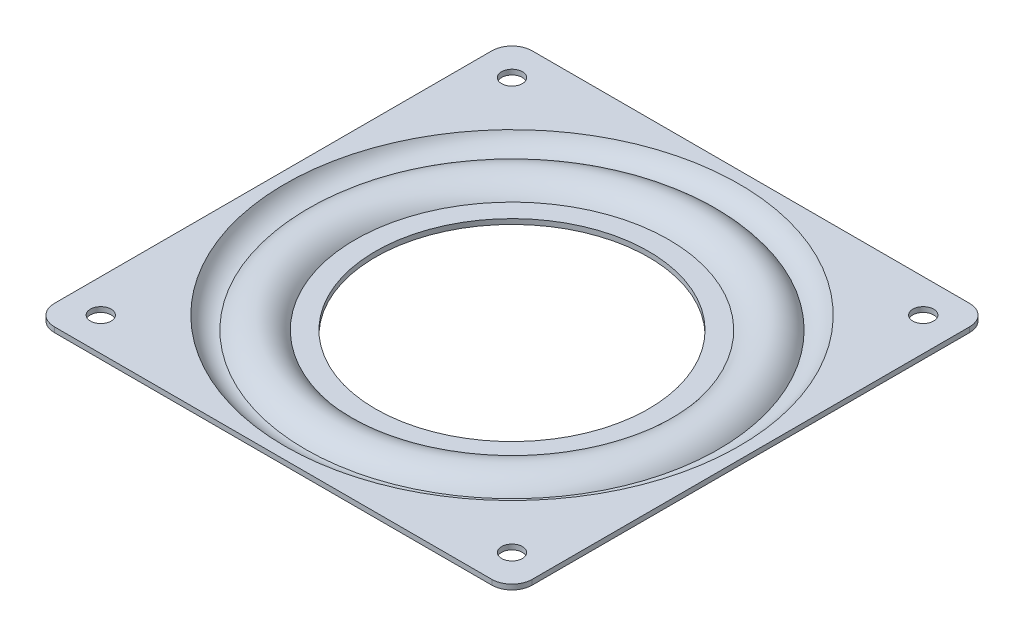
ISO-10303-21;
HEADER;
FILE_DESCRIPTION(('STEP AP214'),'2;1');
FILE_NAME('part.step','',(''),(''),'','','');
FILE_SCHEMA(('AUTOMOTIVE_DESIGN { 1 0 10303 214 1 1 1 1 }'));
ENDSEC;
DATA;
#1=APPLICATION_CONTEXT('core data for automotive mechanical design processes');
#2=APPLICATION_PROTOCOL_DEFINITION('international standard','automotive_design',2000,#1);
#3=PRODUCT_CONTEXT('',#1,'mechanical');
#4=PRODUCT('Part','Part','',(#3));
#5=PRODUCT_RELATED_PRODUCT_CATEGORY('part','',(#4));
#6=PRODUCT_DEFINITION_FORMATION('','',#4);
#7=PRODUCT_DEFINITION_CONTEXT('part definition',#1,'design');
#8=PRODUCT_DEFINITION('design','',#6,#7);
#9=PRODUCT_DEFINITION_SHAPE('','',#8);
#10=(LENGTH_UNIT() NAMED_UNIT(*) SI_UNIT(.MILLI.,.METRE.));
#11=(NAMED_UNIT(*) PLANE_ANGLE_UNIT() SI_UNIT($,.RADIAN.));
#12=(NAMED_UNIT(*) SI_UNIT($,.STERADIAN.) SOLID_ANGLE_UNIT());
#13=UNCERTAINTY_MEASURE_WITH_UNIT(LENGTH_MEASURE(1.E-05),#10,'distance_accuracy_value','');
#14=(GEOMETRIC_REPRESENTATION_CONTEXT(3) GLOBAL_UNCERTAINTY_ASSIGNED_CONTEXT((#13)) GLOBAL_UNIT_ASSIGNED_CONTEXT((#10,
#11,#12)) REPRESENTATION_CONTEXT('',''));
#15=CARTESIAN_POINT('',(0.,0.,0.));
#16=DIRECTION('',(0.,0.,1.));
#17=DIRECTION('',(1.,0.,0.));
#18=AXIS2_PLACEMENT_3D('',#15,#16,#17);
#19=CARTESIAN_POINT('',(0.,1.93021402871017,0.));
#20=DIRECTION('',(0.,1.,0.));
#21=DIRECTION('',(0.,0.,1.));
#22=AXIS2_PLACEMENT_3D('',#19,#20,#21);
#23=TOROIDAL_SURFACE('',#22,40.8455333460894,5.5);
#24=CARTESIAN_POINT('',(0.,-3.5402036630778,0.));
#25=DIRECTION('',(0.,1.,0.));
#26=DIRECTION('',(0.,0.,1.));
#27=AXIS2_PLACEMENT_3D('',#24,#25,#26);
#28=CIRCLE('',#27,40.2758577565007);
#29=CARTESIAN_POINT('',(0.,-3.5402036630778,40.2758577565007));
#30=VERTEX_POINT('',#29);
#31=EDGE_CURVE('E11',#30,#30,#28,.T.);
#32=ORIENTED_EDGE('',*,*,#31,.T.);
#33=EDGE_LOOP('',(#32));
#34=FACE_BOUND('',#33,.T.);
#35=CARTESIAN_POINT('',(0.,-1.,0.));
#36=DIRECTION('',(0.,1.,0.));
#37=DIRECTION('',(0.,0.,1.));
#38=AXIS2_PLACEMENT_3D('',#35,#36,#37);
#39=CIRCLE('',#38,45.4999770019897);
#40=CARTESIAN_POINT('',(0.,-1.,45.4999770019897));
#41=VERTEX_POINT('',#40);
#42=EDGE_CURVE('E44',#41,#41,#39,.F.);
#43=ORIENTED_EDGE('',*,*,#42,.T.);
#44=EDGE_LOOP('',(#43));
#45=FACE_BOUND('',#44,.T.);
#46=ADVANCED_FACE('F41',(#34,#45),#23,.T.);
#47=CARTESIAN_POINT('',(0.,-6.,0.));
#48=DIRECTION('',(0.,1.,0.));
#49=DIRECTION('',(0.,0.,1.));
#50=AXIS2_PLACEMENT_3D('',#47,#48,#49);
#51=TOROIDAL_SURFACE('',#50,35.9227666730447,5.);
#52=CARTESIAN_POINT('',(0.,-3.56978597128984,0.));
#53=DIRECTION('',(0.,1.,0.));
#54=DIRECTION('',(0.,0.,1.));
#55=AXIS2_PLACEMENT_3D('',#52,#53,#54);
#56=CIRCLE('',#55,31.5530916537029);
#57=CARTESIAN_POINT('',(0.,-3.56978597128984,31.5530916537029));
#58=VERTEX_POINT('',#57);
#59=EDGE_CURVE('E50',#58,#58,#56,.T.);
#60=ORIENTED_EDGE('',*,*,#59,.T.);
#61=EDGE_LOOP('',(#60));
#62=FACE_BOUND('',#61,.T.);
#63=ORIENTED_EDGE('',*,*,#31,.F.);
#64=EDGE_LOOP('',(#63));
#65=FACE_BOUND('',#64,.T.);
#66=ADVANCED_FACE('F202',(#62,#65),#51,.F.);
#67=CARTESIAN_POINT('',(0.,-3.56978597128984,0.));
#68=DIRECTION('',(0.,-1.,0.));
#69=DIRECTION('',(0.,0.,-1.));
#70=AXIS2_PLACEMENT_3D('',#67,#68,#69);
#71=PLANE('',#70);
#72=CARTESIAN_POINT('',(0.,-3.56978597128984,0.));
#73=DIRECTION('',(0.,1.,0.));
#74=DIRECTION('',(0.,0.,1.));
#75=AXIS2_PLACEMENT_3D('',#72,#73,#74);
#76=CIRCLE('',#75,27.);
#77=CARTESIAN_POINT('',(0.,-3.56978597128984,27.));
#78=VERTEX_POINT('',#77);
#79=EDGE_CURVE('E196',#78,#78,#76,.T.);
#80=ORIENTED_EDGE('',*,*,#79,.T.);
#81=EDGE_LOOP('',(#80));
#82=FACE_BOUND('',#81,.T.);
#83=ORIENTED_EDGE('',*,*,#59,.F.);
#84=EDGE_LOOP('',(#83));
#85=FACE_BOUND('',#84,.T.);
#86=ADVANCED_FACE('F205',(#82,#85),#71,.T.);
#87=CARTESIAN_POINT('',(0.,6.91716042477171,0.));
#88=DIRECTION('',(0.,1.,0.));
#89=DIRECTION('',(0.,0.,1.));
#90=AXIS2_PLACEMENT_3D('',#87,#88,#89);
#91=CYLINDRICAL_SURFACE('',#90,27.);
#92=ORIENTED_EDGE('',*,*,#79,.F.);
#93=EDGE_LOOP('',(#92));
#94=FACE_BOUND('',#93,.T.);
#95=CARTESIAN_POINT('',(0.,-2.56978597128984,0.));
#96=DIRECTION('',(0.,1.,0.));
#97=DIRECTION('',(0.,0.,1.));
#98=AXIS2_PLACEMENT_3D('',#95,#96,#97);
#99=CIRCLE('',#98,27.);
#100=CARTESIAN_POINT('',(0.,-2.56978597128984,27.));
#101=VERTEX_POINT('',#100);
#102=EDGE_CURVE('E193',#101,#101,#99,.T.);
#103=ORIENTED_EDGE('',*,*,#102,.T.);
#104=EDGE_LOOP('',(#103));
#105=FACE_BOUND('',#104,.T.);
#106=ADVANCED_FACE('F207',(#94,#105),#91,.F.);
#107=CARTESIAN_POINT('',(0.,-2.56978597128984,0.));
#108=DIRECTION('',(0.,-1.,0.));
#109=DIRECTION('',(0.,0.,-1.));
#110=AXIS2_PLACEMENT_3D('',#107,#108,#109);
#111=PLANE('',#110);
#112=ORIENTED_EDGE('',*,*,#102,.F.);
#113=EDGE_LOOP('',(#112));
#114=FACE_BOUND('',#113,.T.);
#115=CARTESIAN_POINT('',(0.,-2.56978597128984,0.));
#116=DIRECTION('',(0.,1.,0.));
#117=DIRECTION('',(0.,0.,1.));
#118=AXIS2_PLACEMENT_3D('',#115,#116,#117);
#119=CIRCLE('',#118,31.);
#120=CARTESIAN_POINT('',(0.,-2.56978597128984,31.));
#121=VERTEX_POINT('',#120);
#122=EDGE_CURVE('E190',#121,#121,#119,.T.);
#123=ORIENTED_EDGE('',*,*,#122,.T.);
#124=EDGE_LOOP('',(#123));
#125=FACE_BOUND('',#124,.T.);
#126=ADVANCED_FACE('F214',(#114,#125),#111,.F.);
#127=CARTESIAN_POINT('',(0.,-6.,0.));
#128=DIRECTION('',(0.,1.,0.));
#129=DIRECTION('',(0.,0.,1.));
#130=AXIS2_PLACEMENT_3D('',#127,#128,#129);
#131=TOROIDAL_SURFACE('',#130,35.9227666730447,6.);
#132=ORIENTED_EDGE('',*,*,#122,.F.);
#133=EDGE_LOOP('',(#132));
#134=FACE_BOUND('',#133,.T.);
#135=CARTESIAN_POINT('',(0.,-2.56978597128983,0.));
#136=DIRECTION('',(0.,1.,0.));
#137=DIRECTION('',(0.,0.,1.));
#138=AXIS2_PLACEMENT_3D('',#135,#136,#137);
#139=CIRCLE('',#138,40.8455333460895);
#140=CARTESIAN_POINT('',(0.,-2.56978597128983,40.8455333460895));
#141=VERTEX_POINT('',#140);
#142=EDGE_CURVE('E187',#141,#141,#139,.T.);
#143=ORIENTED_EDGE('',*,*,#142,.T.);
#144=EDGE_LOOP('',(#143));
#145=FACE_BOUND('',#144,.T.);
#146=ADVANCED_FACE('F309',(#134,#145),#131,.T.);
#147=CARTESIAN_POINT('',(0.,1.93021402871017,0.));
#148=DIRECTION('',(0.,1.,0.));
#149=DIRECTION('',(0.,0.,1.));
#150=AXIS2_PLACEMENT_3D('',#147,#148,#149);
#151=TOROIDAL_SURFACE('',#150,40.8455333460894,4.5);
#152=ORIENTED_EDGE('',*,*,#142,.F.);
#153=EDGE_LOOP('',(#152));
#154=FACE_BOUND('',#153,.T.);
#155=CARTESIAN_POINT('',(0.,0.,0.));
#156=DIRECTION('',(0.,1.,0.));
#157=DIRECTION('',(0.,0.,1.));
#158=AXIS2_PLACEMENT_3D('',#155,#156,#157);
#159=CIRCLE('',#158,44.9105393489596);
#160=CARTESIAN_POINT('',(0.,0.,44.9105393489596));
#161=VERTEX_POINT('',#160);
#162=EDGE_CURVE('E152',#161,#161,#159,.T.);
#163=ORIENTED_EDGE('',*,*,#162,.T.);
#164=EDGE_LOOP('',(#163));
#165=FACE_BOUND('',#164,.T.);
#166=ADVANCED_FACE('F277',(#154,#165),#151,.F.);
#167=CARTESIAN_POINT('',(-47.25,-1.,0.));
#168=DIRECTION('',(-1.,0.,0.));
#169=DIRECTION('',(0.,0.,1.));
#170=AXIS2_PLACEMENT_3D('',#167,#168,#169);
#171=PLANE('',#170);
#172=DIRECTION('',(0.,0.,1.));
#173=VECTOR('',#172,1.);
#174=CARTESIAN_POINT('',(-47.25,0.,0.));
#175=LINE('',#174,#173);
#176=CARTESIAN_POINT('',(-47.25,0.,-43.25));
#177=VERTEX_POINT('',#176);
#178=CARTESIAN_POINT('',(-47.25,0.,43.25));
#179=VERTEX_POINT('',#178);
#180=EDGE_CURVE('E155',#177,#179,#175,.T.);
#181=ORIENTED_EDGE('',*,*,#180,.F.);
#182=DIRECTION('',(0.,1.,0.));
#183=VECTOR('',#182,1.);
#184=CARTESIAN_POINT('',(-47.25,-1.,-43.25));
#185=LINE('',#184,#183);
#186=CARTESIAN_POINT('',(-47.25,-1.,-43.25));
#187=VERTEX_POINT('',#186);
#188=EDGE_CURVE('E58',#187,#177,#185,.T.);
#189=ORIENTED_EDGE('',*,*,#188,.F.);
#190=DIRECTION('',(0.,0.,1.));
#191=VECTOR('',#190,1.);
#192=CARTESIAN_POINT('',(-47.25,-1.,0.));
#193=LINE('',#192,#191);
#194=CARTESIAN_POINT('',(-47.25,-1.,43.25));
#195=VERTEX_POINT('',#194);
#196=EDGE_CURVE('E248',#187,#195,#193,.T.);
#197=ORIENTED_EDGE('',*,*,#196,.T.);
#198=DIRECTION('',(0.,1.,0.));
#199=VECTOR('',#198,1.);
#200=CARTESIAN_POINT('',(-47.25,-1.,43.25));
#201=LINE('',#200,#199);
#202=EDGE_CURVE('E99',#195,#179,#201,.T.);
#203=ORIENTED_EDGE('',*,*,#202,.T.);
#204=EDGE_LOOP('',(#181,#189,#197,#203));
#205=FACE_BOUND('',#204,.T.);
#206=ADVANCED_FACE('F268',(#205),#171,.T.);
#207=CARTESIAN_POINT('',(-43.25,-1.,-43.25));
#208=DIRECTION('',(0.,1.,0.));
#209=DIRECTION('',(0.,0.,1.));
#210=AXIS2_PLACEMENT_3D('',#207,#208,#209);
#211=CYLINDRICAL_SURFACE('',#210,4.);
#212=CARTESIAN_POINT('',(-43.25,0.,-43.25));
#213=DIRECTION('',(0.,1.,0.));
#214=DIRECTION('',(0.,0.,1.));
#215=AXIS2_PLACEMENT_3D('',#212,#213,#214);
#216=CIRCLE('',#215,4.);
#217=CARTESIAN_POINT('',(-43.25,0.,-47.25));
#218=VERTEX_POINT('',#217);
#219=EDGE_CURVE('E173',#218,#177,#216,.T.);
#220=ORIENTED_EDGE('',*,*,#219,.F.);
#221=DIRECTION('',(0.,1.,0.));
#222=VECTOR('',#221,1.);
#223=CARTESIAN_POINT('',(-43.25,-1.,-47.25));
#224=LINE('',#223,#222);
#225=CARTESIAN_POINT('',(-43.25,-1.,-47.25));
#226=VERTEX_POINT('',#225);
#227=EDGE_CURVE('E87',#226,#218,#224,.T.);
#228=ORIENTED_EDGE('',*,*,#227,.F.);
#229=CARTESIAN_POINT('',(-43.25,-1.,-43.25));
#230=DIRECTION('',(0.,1.,0.));
#231=DIRECTION('',(0.,0.,1.));
#232=AXIS2_PLACEMENT_3D('',#229,#230,#231);
#233=CIRCLE('',#232,4.);
#234=EDGE_CURVE('E121',#226,#187,#233,.T.);
#235=ORIENTED_EDGE('',*,*,#234,.T.);
#236=ORIENTED_EDGE('',*,*,#188,.T.);
#237=EDGE_LOOP('',(#220,#228,#235,#236));
#238=FACE_BOUND('',#237,.T.);
#239=ADVANCED_FACE('F270',(#238),#211,.T.);
#240=CARTESIAN_POINT('',(0.,-1.,-47.25));
#241=DIRECTION('',(0.,0.,1.));
#242=DIRECTION('',(1.,0.,0.));
#243=AXIS2_PLACEMENT_3D('',#240,#241,#242);
#244=PLANE('',#243);
#245=DIRECTION('',(1.,0.,0.));
#246=VECTOR('',#245,1.);
#247=CARTESIAN_POINT('',(0.,0.,-47.25));
#248=LINE('',#247,#246);
#249=CARTESIAN_POINT('',(43.25,0.,-47.25));
#250=VERTEX_POINT('',#249);
#251=EDGE_CURVE('E125',#218,#250,#248,.T.);
#252=ORIENTED_EDGE('',*,*,#251,.T.);
#253=DIRECTION('',(0.,1.,0.));
#254=VECTOR('',#253,1.);
#255=CARTESIAN_POINT('',(43.25,-1.,-47.25));
#256=LINE('',#255,#254);
#257=CARTESIAN_POINT('',(43.25,-1.,-47.25));
#258=VERTEX_POINT('',#257);
#259=EDGE_CURVE('E123',#258,#250,#256,.T.);
#260=ORIENTED_EDGE('',*,*,#259,.F.);
#261=DIRECTION('',(1.,0.,0.));
#262=VECTOR('',#261,1.);
#263=CARTESIAN_POINT('',(0.,-1.,-47.25));
#264=LINE('',#263,#262);
#265=EDGE_CURVE('E116',#226,#258,#264,.T.);
#266=ORIENTED_EDGE('',*,*,#265,.F.);
#267=ORIENTED_EDGE('',*,*,#227,.T.);
#268=EDGE_LOOP('',(#252,#260,#266,#267));
#269=FACE_BOUND('',#268,.T.);
#270=ADVANCED_FACE('F124',(#269),#244,.F.);
#271=CARTESIAN_POINT('',(43.25,-1.,-43.25));
#272=DIRECTION('',(0.,1.,0.));
#273=DIRECTION('',(0.,0.,1.));
#274=AXIS2_PLACEMENT_3D('',#271,#272,#273);
#275=CYLINDRICAL_SURFACE('',#274,4.);
#276=CARTESIAN_POINT('',(43.25,0.,-43.25));
#277=DIRECTION('',(0.,1.,0.));
#278=DIRECTION('',(0.,0.,1.));
#279=AXIS2_PLACEMENT_3D('',#276,#277,#278);
#280=CIRCLE('',#279,4.);
#281=CARTESIAN_POINT('',(47.25,0.,-43.25));
#282=VERTEX_POINT('',#281);
#283=EDGE_CURVE('E170',#282,#250,#280,.T.);
#284=ORIENTED_EDGE('',*,*,#283,.F.);
#285=DIRECTION('',(0.,1.,0.));
#286=VECTOR('',#285,1.);
#287=CARTESIAN_POINT('',(47.25,-1.,-43.25));
#288=LINE('',#287,#286);
#289=CARTESIAN_POINT('',(47.25,-1.,-43.25));
#290=VERTEX_POINT('',#289);
#291=EDGE_CURVE('E129',#290,#282,#288,.T.);
#292=ORIENTED_EDGE('',*,*,#291,.F.);
#293=CARTESIAN_POINT('',(43.25,-1.,-43.25));
#294=DIRECTION('',(0.,1.,0.));
#295=DIRECTION('',(0.,0.,1.));
#296=AXIS2_PLACEMENT_3D('',#293,#294,#295);
#297=CIRCLE('',#296,4.);
#298=EDGE_CURVE('E120',#290,#258,#297,.T.);
#299=ORIENTED_EDGE('',*,*,#298,.T.);
#300=ORIENTED_EDGE('',*,*,#259,.T.);
#301=EDGE_LOOP('',(#284,#292,#299,#300));
#302=FACE_BOUND('',#301,.T.);
#303=ADVANCED_FACE('F131',(#302),#275,.T.);
#304=CARTESIAN_POINT('',(47.25,-1.,0.));
#305=DIRECTION('',(-1.,0.,0.));
#306=DIRECTION('',(0.,0.,1.));
#307=AXIS2_PLACEMENT_3D('',#304,#305,#306);
#308=PLANE('',#307);
#309=DIRECTION('',(0.,0.,1.));
#310=VECTOR('',#309,1.);
#311=CARTESIAN_POINT('',(47.25,0.,0.));
#312=LINE('',#311,#310);
#313=CARTESIAN_POINT('',(47.25,0.,43.25));
#314=VERTEX_POINT('',#313);
#315=EDGE_CURVE('E167',#282,#314,#312,.T.);
#316=ORIENTED_EDGE('',*,*,#315,.T.);
#317=DIRECTION('',(0.,1.,0.));
#318=VECTOR('',#317,1.);
#319=CARTESIAN_POINT('',(47.25,-1.,43.25));
#320=LINE('',#319,#318);
#321=CARTESIAN_POINT('',(47.25,-1.,43.25));
#322=VERTEX_POINT('',#321);
#323=EDGE_CURVE('E180',#322,#314,#320,.T.);
#324=ORIENTED_EDGE('',*,*,#323,.F.);
#325=DIRECTION('',(0.,0.,1.));
#326=VECTOR('',#325,1.);
#327=CARTESIAN_POINT('',(47.25,-1.,0.));
#328=LINE('',#327,#326);
#329=EDGE_CURVE('E133',#290,#322,#328,.T.);
#330=ORIENTED_EDGE('',*,*,#329,.F.);
#331=ORIENTED_EDGE('',*,*,#291,.T.);
#332=EDGE_LOOP('',(#316,#324,#330,#331));
#333=FACE_BOUND('',#332,.T.);
#334=ADVANCED_FACE('F283',(#333),#308,.F.);
#335=CARTESIAN_POINT('',(43.25,-1.,43.25));
#336=DIRECTION('',(0.,1.,0.));
#337=DIRECTION('',(0.,0.,1.));
#338=AXIS2_PLACEMENT_3D('',#335,#336,#337);
#339=CYLINDRICAL_SURFACE('',#338,4.);
#340=CARTESIAN_POINT('',(43.25,0.,43.25));
#341=DIRECTION('',(0.,1.,0.));
#342=DIRECTION('',(0.,0.,1.));
#343=AXIS2_PLACEMENT_3D('',#340,#341,#342);
#344=CIRCLE('',#343,4.);
#345=CARTESIAN_POINT('',(43.25,0.,47.25));
#346=VERTEX_POINT('',#345);
#347=EDGE_CURVE('E164',#346,#314,#344,.T.);
#348=ORIENTED_EDGE('',*,*,#347,.F.);
#349=DIRECTION('',(0.,1.,0.));
#350=VECTOR('',#349,1.);
#351=CARTESIAN_POINT('',(43.25,-1.,47.25));
#352=LINE('',#351,#350);
#353=CARTESIAN_POINT('',(43.25,-1.,47.25));
#354=VERTEX_POINT('',#353);
#355=EDGE_CURVE('E182',#354,#346,#352,.T.);
#356=ORIENTED_EDGE('',*,*,#355,.F.);
#357=CARTESIAN_POINT('',(43.25,-1.,43.25));
#358=DIRECTION('',(0.,1.,0.));
#359=DIRECTION('',(0.,0.,1.));
#360=AXIS2_PLACEMENT_3D('',#357,#358,#359);
#361=CIRCLE('',#360,4.);
#362=EDGE_CURVE('E135',#354,#322,#361,.T.);
#363=ORIENTED_EDGE('',*,*,#362,.T.);
#364=ORIENTED_EDGE('',*,*,#323,.T.);
#365=EDGE_LOOP('',(#348,#356,#363,#364));
#366=FACE_BOUND('',#365,.T.);
#367=ADVANCED_FACE('F262',(#366),#339,.T.);
#368=CARTESIAN_POINT('',(0.,-1.,47.25));
#369=DIRECTION('',(0.,0.,1.));
#370=DIRECTION('',(1.,0.,0.));
#371=AXIS2_PLACEMENT_3D('',#368,#369,#370);
#372=PLANE('',#371);
#373=DIRECTION('',(1.,0.,0.));
#374=VECTOR('',#373,1.);
#375=CARTESIAN_POINT('',(0.,0.,47.25));
#376=LINE('',#375,#374);
#377=CARTESIAN_POINT('',(-43.25,0.,47.25));
#378=VERTEX_POINT('',#377);
#379=EDGE_CURVE('E161',#378,#346,#376,.T.);
#380=ORIENTED_EDGE('',*,*,#379,.F.);
#381=DIRECTION('',(0.,1.,0.));
#382=VECTOR('',#381,1.);
#383=CARTESIAN_POINT('',(-43.25,-1.,47.25));
#384=LINE('',#383,#382);
#385=CARTESIAN_POINT('',(-43.25,-1.,47.25));
#386=VERTEX_POINT('',#385);
#387=EDGE_CURVE('E184',#386,#378,#384,.T.);
#388=ORIENTED_EDGE('',*,*,#387,.F.);
#389=DIRECTION('',(1.,0.,0.));
#390=VECTOR('',#389,1.);
#391=CARTESIAN_POINT('',(0.,-1.,47.25));
#392=LINE('',#391,#390);
#393=EDGE_CURVE('E256',#386,#354,#392,.T.);
#394=ORIENTED_EDGE('',*,*,#393,.T.);
#395=ORIENTED_EDGE('',*,*,#355,.T.);
#396=EDGE_LOOP('',(#380,#388,#394,#395));
#397=FACE_BOUND('',#396,.T.);
#398=ADVANCED_FACE('F267',(#397),#372,.T.);
#399=CARTESIAN_POINT('',(-40.6586399182265,-1.,-40.6586399182265));
#400=DIRECTION('',(0.,1.,0.));
#401=DIRECTION('',(0.,0.,1.));
#402=AXIS2_PLACEMENT_3D('',#399,#400,#401);
#403=CYLINDRICAL_SURFACE('',#402,2.05);
#404=CARTESIAN_POINT('',(-40.6586399182265,-1.,-40.6586399182265));
#405=DIRECTION('',(0.,1.,0.));
#406=DIRECTION('',(0.,0.,1.));
#407=AXIS2_PLACEMENT_3D('',#404,#405,#406);
#408=CIRCLE('',#407,2.05);
#409=CARTESIAN_POINT('',(-40.6586399182265,-1.,-38.6086399182265));
#410=VERTEX_POINT('',#409);
#411=EDGE_CURVE('E246',#410,#410,#408,.T.);
#412=ORIENTED_EDGE('',*,*,#411,.F.);
#413=EDGE_LOOP('',(#412));
#414=FACE_BOUND('',#413,.T.);
#415=CARTESIAN_POINT('',(-40.6586399182265,0.,-40.6586399182265));
#416=DIRECTION('',(0.,1.,0.));
#417=DIRECTION('',(0.,0.,1.));
#418=AXIS2_PLACEMENT_3D('',#415,#416,#417);
#419=CIRCLE('',#418,2.05);
#420=CARTESIAN_POINT('',(-40.6586399182265,0.,-38.6086399182265));
#421=VERTEX_POINT('',#420);
#422=EDGE_CURVE('E149',#421,#421,#419,.T.);
#423=ORIENTED_EDGE('',*,*,#422,.T.);
#424=EDGE_LOOP('',(#423));
#425=FACE_BOUND('',#424,.T.);
#426=ADVANCED_FACE('F291',(#414,#425),#403,.F.);
#427=CARTESIAN_POINT('',(40.6586399182289,-1.,-40.6586399182241));
#428=DIRECTION('',(0.,1.,0.));
#429=DIRECTION('',(0.,0.,1.));
#430=AXIS2_PLACEMENT_3D('',#427,#428,#429);
#431=CYLINDRICAL_SURFACE('',#430,2.05);
#432=CARTESIAN_POINT('',(40.6586399182289,-1.,-40.6586399182241));
#433=DIRECTION('',(0.,1.,0.));
#434=DIRECTION('',(0.,0.,1.));
#435=AXIS2_PLACEMENT_3D('',#432,#433,#434);
#436=CIRCLE('',#435,2.05);
#437=CARTESIAN_POINT('',(40.6586399182289,-1.,-38.6086399182241));
#438=VERTEX_POINT('',#437);
#439=EDGE_CURVE('E243',#438,#438,#436,.T.);
#440=ORIENTED_EDGE('',*,*,#439,.F.);
#441=EDGE_LOOP('',(#440));
#442=FACE_BOUND('',#441,.T.);
#443=CARTESIAN_POINT('',(40.6586399182289,0.,-40.6586399182241));
#444=DIRECTION('',(0.,1.,0.));
#445=DIRECTION('',(0.,0.,1.));
#446=AXIS2_PLACEMENT_3D('',#443,#444,#445);
#447=CIRCLE('',#446,2.05);
#448=CARTESIAN_POINT('',(40.6586399182289,0.,-38.6086399182241));
#449=VERTEX_POINT('',#448);
#450=EDGE_CURVE('E146',#449,#449,#447,.T.);
#451=ORIENTED_EDGE('',*,*,#450,.T.);
#452=EDGE_LOOP('',(#451));
#453=FACE_BOUND('',#452,.T.);
#454=ADVANCED_FACE('F297',(#442,#453),#431,.F.);
#455=CARTESIAN_POINT('',(40.6586399182217,-1.,40.6586399182313));
#456=DIRECTION('',(0.,1.,0.));
#457=DIRECTION('',(0.,0.,1.));
#458=AXIS2_PLACEMENT_3D('',#455,#456,#457);
#459=CYLINDRICAL_SURFACE('',#458,2.04999999999999);
#460=CARTESIAN_POINT('',(40.6586399182217,-1.,40.6586399182313));
#461=DIRECTION('',(0.,1.,0.));
#462=DIRECTION('',(0.,0.,1.));
#463=AXIS2_PLACEMENT_3D('',#460,#461,#462);
#464=CIRCLE('',#463,2.04999999999999);
#465=CARTESIAN_POINT('',(40.6586399182217,-1.,42.7086399182313));
#466=VERTEX_POINT('',#465);
#467=EDGE_CURVE('E239',#466,#466,#464,.T.);
#468=ORIENTED_EDGE('',*,*,#467,.F.);
#469=EDGE_LOOP('',(#468));
#470=FACE_BOUND('',#469,.T.);
#471=CARTESIAN_POINT('',(40.6586399182217,0.,40.6586399182313));
#472=DIRECTION('',(0.,1.,0.));
#473=DIRECTION('',(0.,0.,1.));
#474=AXIS2_PLACEMENT_3D('',#471,#472,#473);
#475=CIRCLE('',#474,2.04999999999999);
#476=CARTESIAN_POINT('',(40.6586399182217,0.,42.7086399182313));
#477=VERTEX_POINT('',#476);
#478=EDGE_CURVE('E143',#477,#477,#475,.T.);
#479=ORIENTED_EDGE('',*,*,#478,.T.);
#480=EDGE_LOOP('',(#479));
#481=FACE_BOUND('',#480,.T.);
#482=ADVANCED_FACE('F300',(#470,#481),#459,.F.);
#483=CARTESIAN_POINT('',(-40.6586399182337,-1.,40.6586399182193));
#484=DIRECTION('',(0.,1.,0.));
#485=DIRECTION('',(0.,0.,1.));
#486=AXIS2_PLACEMENT_3D('',#483,#484,#485);
#487=CYLINDRICAL_SURFACE('',#486,2.04999999999999);
#488=CARTESIAN_POINT('',(-40.6586399182337,-1.,40.6586399182193));
#489=DIRECTION('',(0.,1.,0.));
#490=DIRECTION('',(0.,0.,1.));
#491=AXIS2_PLACEMENT_3D('',#488,#489,#490);
#492=CIRCLE('',#491,2.04999999999999);
#493=CARTESIAN_POINT('',(-40.6586399182337,-1.,42.7086399182193));
#494=VERTEX_POINT('',#493);
#495=EDGE_CURVE('E176',#494,#494,#492,.T.);
#496=ORIENTED_EDGE('',*,*,#495,.F.);
#497=EDGE_LOOP('',(#496));
#498=FACE_BOUND('',#497,.T.);
#499=CARTESIAN_POINT('',(-40.6586399182337,0.,40.6586399182193));
#500=DIRECTION('',(0.,1.,0.));
#501=DIRECTION('',(0.,0.,1.));
#502=AXIS2_PLACEMENT_3D('',#499,#500,#501);
#503=CIRCLE('',#502,2.04999999999999);
#504=CARTESIAN_POINT('',(-40.6586399182337,0.,42.7086399182193));
#505=VERTEX_POINT('',#504);
#506=EDGE_CURVE('E140',#505,#505,#503,.T.);
#507=ORIENTED_EDGE('',*,*,#506,.T.);
#508=EDGE_LOOP('',(#507));
#509=FACE_BOUND('',#508,.T.);
#510=ADVANCED_FACE('F293',(#498,#509),#487,.F.);
#511=CARTESIAN_POINT('',(-43.25,-1.,43.25));
#512=DIRECTION('',(0.,1.,0.));
#513=DIRECTION('',(0.,0.,1.));
#514=AXIS2_PLACEMENT_3D('',#511,#512,#513);
#515=CYLINDRICAL_SURFACE('',#514,4.);
#516=CARTESIAN_POINT('',(-43.25,0.,43.25));
#517=DIRECTION('',(0.,1.,0.));
#518=DIRECTION('',(0.,0.,1.));
#519=AXIS2_PLACEMENT_3D('',#516,#517,#518);
#520=CIRCLE('',#519,4.);
#521=EDGE_CURVE('E158',#179,#378,#520,.T.);
#522=ORIENTED_EDGE('',*,*,#521,.F.);
#523=ORIENTED_EDGE('',*,*,#202,.F.);
#524=CARTESIAN_POINT('',(-43.25,-1.,43.25));
#525=DIRECTION('',(0.,1.,0.));
#526=DIRECTION('',(0.,0.,1.));
#527=AXIS2_PLACEMENT_3D('',#524,#525,#526);
#528=CIRCLE('',#527,4.);
#529=EDGE_CURVE('E250',#195,#386,#528,.T.);
#530=ORIENTED_EDGE('',*,*,#529,.T.);
#531=ORIENTED_EDGE('',*,*,#387,.T.);
#532=EDGE_LOOP('',(#522,#523,#530,#531));
#533=FACE_BOUND('',#532,.T.);
#534=ADVANCED_FACE('F231',(#533),#515,.T.);
#535=CARTESIAN_POINT('',(0.,-1.,0.));
#536=DIRECTION('',(0.,1.,0.));
#537=DIRECTION('',(0.,0.,1.));
#538=AXIS2_PLACEMENT_3D('',#535,#536,#537);
#539=PLANE('',#538);
#540=ORIENTED_EDGE('',*,*,#42,.F.);
#541=EDGE_LOOP('',(#540));
#542=FACE_BOUND('',#541,.T.);
#543=ORIENTED_EDGE('',*,*,#495,.T.);
#544=EDGE_LOOP('',(#543));
#545=FACE_BOUND('',#544,.T.);
#546=ORIENTED_EDGE('',*,*,#467,.T.);
#547=EDGE_LOOP('',(#546));
#548=FACE_BOUND('',#547,.T.);
#549=ORIENTED_EDGE('',*,*,#439,.T.);
#550=EDGE_LOOP('',(#549));
#551=FACE_BOUND('',#550,.T.);
#552=ORIENTED_EDGE('',*,*,#411,.T.);
#553=EDGE_LOOP('',(#552));
#554=FACE_BOUND('',#553,.T.);
#555=ORIENTED_EDGE('',*,*,#196,.F.);
#556=ORIENTED_EDGE('',*,*,#234,.F.);
#557=ORIENTED_EDGE('',*,*,#265,.T.);
#558=ORIENTED_EDGE('',*,*,#298,.F.);
#559=ORIENTED_EDGE('',*,*,#329,.T.);
#560=ORIENTED_EDGE('',*,*,#362,.F.);
#561=ORIENTED_EDGE('',*,*,#393,.F.);
#562=ORIENTED_EDGE('',*,*,#529,.F.);
#563=EDGE_LOOP('',(#555,#556,#557,#558,#559,#560,#561,#562));
#564=FACE_BOUND('',#563,.T.);
#565=ADVANCED_FACE('F118',(#542,#545,#548,#551,#554,#564),#539,.F.);
#566=CARTESIAN_POINT('',(0.,0.,0.));
#567=DIRECTION('',(0.,1.,0.));
#568=DIRECTION('',(0.,0.,1.));
#569=AXIS2_PLACEMENT_3D('',#566,#567,#568);
#570=PLANE('',#569);
#571=ORIENTED_EDGE('',*,*,#506,.F.);
#572=EDGE_LOOP('',(#571));
#573=FACE_BOUND('',#572,.T.);
#574=ORIENTED_EDGE('',*,*,#478,.F.);
#575=EDGE_LOOP('',(#574));
#576=FACE_BOUND('',#575,.T.);
#577=ORIENTED_EDGE('',*,*,#450,.F.);
#578=EDGE_LOOP('',(#577));
#579=FACE_BOUND('',#578,.T.);
#580=ORIENTED_EDGE('',*,*,#422,.F.);
#581=EDGE_LOOP('',(#580));
#582=FACE_BOUND('',#581,.T.);
#583=ORIENTED_EDGE('',*,*,#162,.F.);
#584=EDGE_LOOP('',(#583));
#585=FACE_BOUND('',#584,.T.);
#586=ORIENTED_EDGE('',*,*,#180,.T.);
#587=ORIENTED_EDGE('',*,*,#521,.T.);
#588=ORIENTED_EDGE('',*,*,#379,.T.);
#589=ORIENTED_EDGE('',*,*,#347,.T.);
#590=ORIENTED_EDGE('',*,*,#315,.F.);
#591=ORIENTED_EDGE('',*,*,#283,.T.);
#592=ORIENTED_EDGE('',*,*,#251,.F.);
#593=ORIENTED_EDGE('',*,*,#219,.T.);
#594=EDGE_LOOP('',(#586,#587,#588,#589,#590,#591,#592,#593));
#595=FACE_BOUND('',#594,.T.);
#596=ADVANCED_FACE('F230',(#573,#576,#579,#582,#585,#595),#570,.T.);
#597=CLOSED_SHELL('',(#46,#66,#86,#106,#126,#146,#166,#206,#239,#270,#303,#334,#367,#398,#426,
#454,#482,#510,#534,#565,#596));
#598=MANIFOLD_SOLID_BREP('B2',#597);
#599=ADVANCED_BREP_SHAPE_REPRESENTATION('',(#18,#598),#14);
#600=SHAPE_DEFINITION_REPRESENTATION(#9,#599);
ENDSEC;
END-ISO-10303-21;
